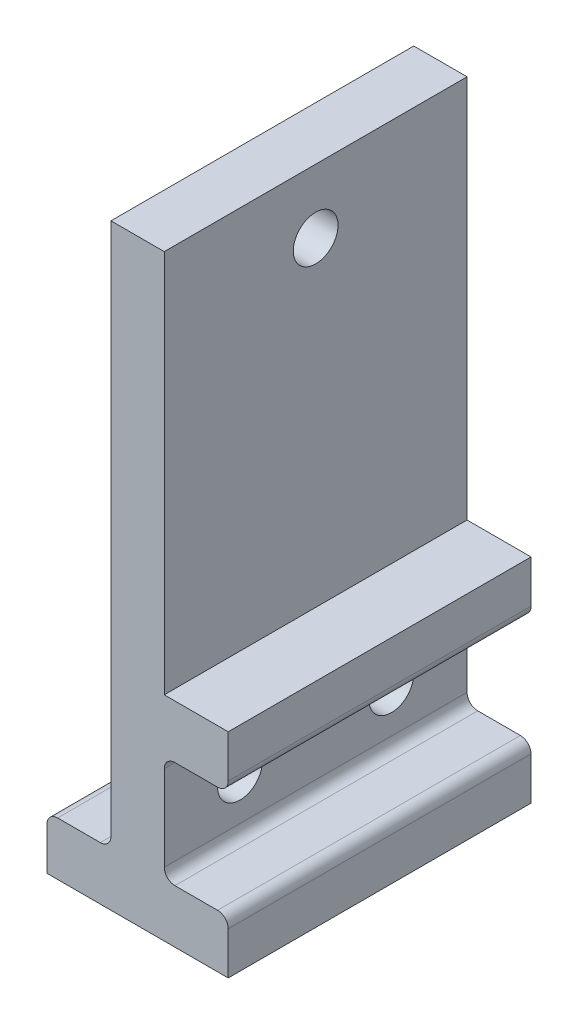
ISO-10303-21;
HEADER;
FILE_DESCRIPTION(('STEP AP214'),'2;1');
FILE_NAME('part.step','',(''),(''),'','','');
FILE_SCHEMA(('AUTOMOTIVE_DESIGN { 1 0 10303 214 1 1 1 1 }'));
ENDSEC;
DATA;
#1=APPLICATION_CONTEXT('core data for automotive mechanical design processes');
#2=APPLICATION_PROTOCOL_DEFINITION('international standard','automotive_design',2000,#1);
#3=PRODUCT_CONTEXT('',#1,'mechanical');
#4=PRODUCT('Part','Part','',(#3));
#5=PRODUCT_RELATED_PRODUCT_CATEGORY('part','',(#4));
#6=PRODUCT_DEFINITION_FORMATION('','',#4);
#7=PRODUCT_DEFINITION_CONTEXT('part definition',#1,'design');
#8=PRODUCT_DEFINITION('design','',#6,#7);
#9=PRODUCT_DEFINITION_SHAPE('','',#8);
#10=(LENGTH_UNIT() NAMED_UNIT(*) SI_UNIT(.MILLI.,.METRE.));
#11=(NAMED_UNIT(*) PLANE_ANGLE_UNIT() SI_UNIT($,.RADIAN.));
#12=(NAMED_UNIT(*) SI_UNIT($,.STERADIAN.) SOLID_ANGLE_UNIT());
#13=UNCERTAINTY_MEASURE_WITH_UNIT(LENGTH_MEASURE(1.E-05),#10,'distance_accuracy_value','');
#14=(GEOMETRIC_REPRESENTATION_CONTEXT(3) GLOBAL_UNCERTAINTY_ASSIGNED_CONTEXT((#13)) GLOBAL_UNIT_ASSIGNED_CONTEXT((#10,
#11,#12)) REPRESENTATION_CONTEXT('',''));
#15=CARTESIAN_POINT('',(0.,0.,0.));
#16=DIRECTION('',(0.,0.,1.));
#17=DIRECTION('',(1.,0.,0.));
#18=AXIS2_PLACEMENT_3D('',#15,#16,#17);
#19=CARTESIAN_POINT('',(0.,0.,56.8));
#20=DIRECTION('',(0.,1.,0.));
#21=DIRECTION('',(0.,0.,1.));
#22=AXIS2_PLACEMENT_3D('',#19,#20,#21);
#23=PLANE('',#22);
#24=DIRECTION('',(1.,0.,0.));
#25=VECTOR('',#24,1.);
#26=CARTESIAN_POINT('',(0.,0.,0.));
#27=LINE('',#26,#25);
#28=CARTESIAN_POINT('',(0.,0.,0.));
#29=VERTEX_POINT('',#28);
#30=CARTESIAN_POINT('',(34.,0.,0.));
#31=VERTEX_POINT('',#30);
#32=EDGE_CURVE('E185',#29,#31,#27,.T.);
#33=ORIENTED_EDGE('',*,*,#32,.T.);
#34=DIRECTION('',(0.,0.,-1.));
#35=VECTOR('',#34,1.);
#36=CARTESIAN_POINT('',(34.,0.,56.8));
#37=LINE('',#36,#35);
#38=CARTESIAN_POINT('',(34.,0.,56.8));
#39=VERTEX_POINT('',#38);
#40=EDGE_CURVE('E166',#39,#31,#37,.T.);
#41=ORIENTED_EDGE('',*,*,#40,.F.);
#42=DIRECTION('',(1.,0.,0.));
#43=VECTOR('',#42,1.);
#44=CARTESIAN_POINT('',(0.,0.,56.8));
#45=LINE('',#44,#43);
#46=CARTESIAN_POINT('',(0.,0.,56.8));
#47=VERTEX_POINT('',#46);
#48=EDGE_CURVE('E172',#47,#39,#45,.T.);
#49=ORIENTED_EDGE('',*,*,#48,.F.);
#50=DIRECTION('',(0.,0.,-1.));
#51=VECTOR('',#50,1.);
#52=CARTESIAN_POINT('',(0.,0.,56.8));
#53=LINE('',#52,#51);
#54=EDGE_CURVE('E280',#47,#29,#53,.T.);
#55=ORIENTED_EDGE('',*,*,#54,.T.);
#56=EDGE_LOOP('',(#33,#41,#49,#55));
#57=FACE_BOUND('',#56,.T.);
#58=ADVANCED_FACE('F35',(#57),#23,.F.);
#59=CARTESIAN_POINT('',(34.,10.,56.8));
#60=DIRECTION('',(-1.,0.,0.));
#61=DIRECTION('',(0.,0.,1.));
#62=AXIS2_PLACEMENT_3D('',#59,#60,#61);
#63=PLANE('',#62);
#64=DIRECTION('',(0.,1.,0.));
#65=VECTOR('',#64,1.);
#66=CARTESIAN_POINT('',(34.,10.,0.));
#67=LINE('',#66,#65);
#68=CARTESIAN_POINT('',(34.,8.,0.));
#69=VERTEX_POINT('',#68);
#70=EDGE_CURVE('E282',#31,#69,#67,.T.);
#71=ORIENTED_EDGE('',*,*,#70,.T.);
#72=DIRECTION('',(0.,0.,-1.));
#73=VECTOR('',#72,1.);
#74=CARTESIAN_POINT('',(34.,8.,56.8));
#75=LINE('',#74,#73);
#76=CARTESIAN_POINT('',(34.,8.,56.8));
#77=VERTEX_POINT('',#76);
#78=EDGE_CURVE('E169',#69,#77,#75,.F.);
#79=ORIENTED_EDGE('',*,*,#78,.T.);
#80=DIRECTION('',(0.,1.,0.));
#81=VECTOR('',#80,1.);
#82=CARTESIAN_POINT('',(34.,10.,56.8));
#83=LINE('',#82,#81);
#84=EDGE_CURVE('E161',#39,#77,#83,.T.);
#85=ORIENTED_EDGE('',*,*,#84,.F.);
#86=ORIENTED_EDGE('',*,*,#40,.T.);
#87=EDGE_LOOP('',(#71,#79,#85,#86));
#88=FACE_BOUND('',#87,.T.);
#89=ADVANCED_FACE('F164',(#88),#63,.F.);
#90=CARTESIAN_POINT('',(22.,10.,56.8));
#91=DIRECTION('',(0.,-1.,0.));
#92=DIRECTION('',(1.,0.,0.));
#93=AXIS2_PLACEMENT_3D('',#90,#91,#92);
#94=PLANE('',#93);
#95=DIRECTION('',(-1.,0.,0.));
#96=VECTOR('',#95,1.);
#97=CARTESIAN_POINT('',(22.,10.,56.8));
#98=LINE('',#97,#96);
#99=CARTESIAN_POINT('',(32.,10.,56.8));
#100=VERTEX_POINT('',#99);
#101=CARTESIAN_POINT('',(24.,10.,56.8));
#102=VERTEX_POINT('',#101);
#103=EDGE_CURVE('E171',#100,#102,#98,.T.);
#104=ORIENTED_EDGE('',*,*,#103,.F.);
#105=DIRECTION('',(0.,0.,-1.));
#106=VECTOR('',#105,1.);
#107=CARTESIAN_POINT('',(32.,10.,56.8));
#108=LINE('',#107,#106);
#109=CARTESIAN_POINT('',(32.,10.,0.));
#110=VERTEX_POINT('',#109);
#111=EDGE_CURVE('E216',#100,#110,#108,.T.);
#112=ORIENTED_EDGE('',*,*,#111,.T.);
#113=DIRECTION('',(-1.,0.,0.));
#114=VECTOR('',#113,1.);
#115=CARTESIAN_POINT('',(22.,10.,0.));
#116=LINE('',#115,#114);
#117=CARTESIAN_POINT('',(24.,10.,0.));
#118=VERTEX_POINT('',#117);
#119=EDGE_CURVE('E255',#110,#118,#116,.T.);
#120=ORIENTED_EDGE('',*,*,#119,.T.);
#121=DIRECTION('',(0.,0.,-1.));
#122=VECTOR('',#121,1.);
#123=CARTESIAN_POINT('',(24.,10.,56.8));
#124=LINE('',#123,#122);
#125=EDGE_CURVE('E214',#118,#102,#124,.F.);
#126=ORIENTED_EDGE('',*,*,#125,.T.);
#127=EDGE_LOOP('',(#104,#112,#120,#126));
#128=FACE_BOUND('',#127,.T.);
#129=ADVANCED_FACE('F353',(#128),#94,.F.);
#130=CARTESIAN_POINT('',(22.,30.,56.8));
#131=DIRECTION('',(-1.,0.,0.));
#132=DIRECTION('',(0.,-1.,0.));
#133=AXIS2_PLACEMENT_3D('',#130,#131,#132);
#134=PLANE('',#133);
#135=CARTESIAN_POINT('',(22.,20.,14.2));
#136=DIRECTION('',(-1.,0.,0.));
#137=DIRECTION('',(0.,-1.,0.));
#138=AXIS2_PLACEMENT_3D('',#135,#136,#137);
#139=CIRCLE('',#138,4.2);
#140=CARTESIAN_POINT('',(22.,15.8,14.2));
#141=VERTEX_POINT('',#140);
#142=EDGE_CURVE('E283',#141,#141,#139,.F.);
#143=ORIENTED_EDGE('',*,*,#142,.F.);
#144=EDGE_LOOP('',(#143));
#145=FACE_BOUND('',#144,.T.);
#146=CARTESIAN_POINT('',(22.,20.,42.6));
#147=DIRECTION('',(-1.,0.,0.));
#148=DIRECTION('',(0.,-1.,0.));
#149=AXIS2_PLACEMENT_3D('',#146,#147,#148);
#150=CIRCLE('',#149,4.2);
#151=CARTESIAN_POINT('',(22.,15.8,42.6));
#152=VERTEX_POINT('',#151);
#153=EDGE_CURVE('E356',#152,#152,#150,.F.);
#154=ORIENTED_EDGE('',*,*,#153,.F.);
#155=EDGE_LOOP('',(#154));
#156=FACE_BOUND('',#155,.T.);
#157=DIRECTION('',(0.,1.,0.));
#158=VECTOR('',#157,1.);
#159=CARTESIAN_POINT('',(22.,30.,56.8));
#160=LINE('',#159,#158);
#161=CARTESIAN_POINT('',(22.,12.,56.8));
#162=VERTEX_POINT('',#161);
#163=CARTESIAN_POINT('',(22.,28.,56.8));
#164=VERTEX_POINT('',#163);
#165=EDGE_CURVE('E260',#162,#164,#160,.T.);
#166=ORIENTED_EDGE('',*,*,#165,.F.);
#167=DIRECTION('',(0.,0.,-1.));
#168=VECTOR('',#167,1.);
#169=CARTESIAN_POINT('',(22.,12.,0.));
#170=LINE('',#169,#168);
#171=CARTESIAN_POINT('',(22.,12.,0.));
#172=VERTEX_POINT('',#171);
#173=EDGE_CURVE('E222',#162,#172,#170,.T.);
#174=ORIENTED_EDGE('',*,*,#173,.T.);
#175=DIRECTION('',(0.,1.,0.));
#176=VECTOR('',#175,1.);
#177=CARTESIAN_POINT('',(22.,30.,0.));
#178=LINE('',#177,#176);
#179=CARTESIAN_POINT('',(22.,28.,0.));
#180=VERTEX_POINT('',#179);
#181=EDGE_CURVE('E245',#172,#180,#178,.T.);
#182=ORIENTED_EDGE('',*,*,#181,.T.);
#183=DIRECTION('',(0.,0.,-1.));
#184=VECTOR('',#183,1.);
#185=CARTESIAN_POINT('',(22.,28.,56.8));
#186=LINE('',#185,#184);
#187=EDGE_CURVE('E220',#180,#164,#186,.F.);
#188=ORIENTED_EDGE('',*,*,#187,.T.);
#189=EDGE_LOOP('',(#166,#174,#182,#188));
#190=FACE_BOUND('',#189,.T.);
#191=ADVANCED_FACE('F252',(#145,#156,#190),#134,.F.);
#192=CARTESIAN_POINT('',(34.,30.,56.8));
#193=DIRECTION('',(0.,1.,0.));
#194=DIRECTION('',(-1.,0.,0.));
#195=AXIS2_PLACEMENT_3D('',#192,#193,#194);
#196=PLANE('',#195);
#197=DIRECTION('',(1.,0.,0.));
#198=VECTOR('',#197,1.);
#199=CARTESIAN_POINT('',(34.,30.,56.8));
#200=LINE('',#199,#198);
#201=CARTESIAN_POINT('',(24.,30.,56.8));
#202=VERTEX_POINT('',#201);
#203=CARTESIAN_POINT('',(32.,30.,56.8));
#204=VERTEX_POINT('',#203);
#205=EDGE_CURVE('E259',#202,#204,#200,.T.);
#206=ORIENTED_EDGE('',*,*,#205,.F.);
#207=DIRECTION('',(0.,0.,-1.));
#208=VECTOR('',#207,1.);
#209=CARTESIAN_POINT('',(24.,30.,0.));
#210=LINE('',#209,#208);
#211=CARTESIAN_POINT('',(24.,30.,0.));
#212=VERTEX_POINT('',#211);
#213=EDGE_CURVE('E226',#202,#212,#210,.T.);
#214=ORIENTED_EDGE('',*,*,#213,.T.);
#215=DIRECTION('',(1.,0.,0.));
#216=VECTOR('',#215,1.);
#217=CARTESIAN_POINT('',(34.,30.,0.));
#218=LINE('',#217,#216);
#219=CARTESIAN_POINT('',(32.,30.,0.));
#220=VERTEX_POINT('',#219);
#221=EDGE_CURVE('E246',#212,#220,#218,.T.);
#222=ORIENTED_EDGE('',*,*,#221,.T.);
#223=DIRECTION('',(0.,0.,-1.));
#224=VECTOR('',#223,1.);
#225=CARTESIAN_POINT('',(32.,30.,56.8));
#226=LINE('',#225,#224);
#227=EDGE_CURVE('E58',#220,#204,#226,.F.);
#228=ORIENTED_EDGE('',*,*,#227,.T.);
#229=EDGE_LOOP('',(#206,#214,#222,#228));
#230=FACE_BOUND('',#229,.T.);
#231=ADVANCED_FACE('F261',(#230),#196,.F.);
#232=CARTESIAN_POINT('',(34.,40.,56.8));
#233=DIRECTION('',(-1.,0.,0.));
#234=DIRECTION('',(0.,0.,1.));
#235=AXIS2_PLACEMENT_3D('',#232,#233,#234);
#236=PLANE('',#235);
#237=DIRECTION('',(0.,1.,0.));
#238=VECTOR('',#237,1.);
#239=CARTESIAN_POINT('',(34.,40.,56.8));
#240=LINE('',#239,#238);
#241=CARTESIAN_POINT('',(34.,32.,56.8));
#242=VERTEX_POINT('',#241);
#243=CARTESIAN_POINT('',(34.,40.,56.8));
#244=VERTEX_POINT('',#243);
#245=EDGE_CURVE('E262',#242,#244,#240,.T.);
#246=ORIENTED_EDGE('',*,*,#245,.F.);
#247=DIRECTION('',(0.,0.,-1.));
#248=VECTOR('',#247,1.);
#249=CARTESIAN_POINT('',(34.,32.,56.8));
#250=LINE('',#249,#248);
#251=CARTESIAN_POINT('',(34.,32.,0.));
#252=VERTEX_POINT('',#251);
#253=EDGE_CURVE('E229',#242,#252,#250,.T.);
#254=ORIENTED_EDGE('',*,*,#253,.T.);
#255=DIRECTION('',(0.,1.,0.));
#256=VECTOR('',#255,1.);
#257=CARTESIAN_POINT('',(34.,40.,0.));
#258=LINE('',#257,#256);
#259=CARTESIAN_POINT('',(34.,40.,0.));
#260=VERTEX_POINT('',#259);
#261=EDGE_CURVE('E288',#252,#260,#258,.T.);
#262=ORIENTED_EDGE('',*,*,#261,.T.);
#263=DIRECTION('',(0.,0.,-1.));
#264=VECTOR('',#263,1.);
#265=CARTESIAN_POINT('',(34.,40.,56.8));
#266=LINE('',#265,#264);
#267=EDGE_CURVE('E187',#244,#260,#266,.T.);
#268=ORIENTED_EDGE('',*,*,#267,.F.);
#269=EDGE_LOOP('',(#246,#254,#262,#268));
#270=FACE_BOUND('',#269,.T.);
#271=ADVANCED_FACE('F398',(#270),#236,.F.);
#272=CARTESIAN_POINT('',(22.,40.,56.8));
#273=DIRECTION('',(0.,-1.,0.));
#274=DIRECTION('',(0.,0.,-1.));
#275=AXIS2_PLACEMENT_3D('',#272,#273,#274);
#276=PLANE('',#275);
#277=DIRECTION('',(-1.,0.,0.));
#278=VECTOR('',#277,1.);
#279=CARTESIAN_POINT('',(22.,40.,0.));
#280=LINE('',#279,#278);
#281=CARTESIAN_POINT('',(22.,40.,0.));
#282=VERTEX_POINT('',#281);
#283=EDGE_CURVE('E290',#260,#282,#280,.T.);
#284=ORIENTED_EDGE('',*,*,#283,.T.);
#285=DIRECTION('',(0.,0.,-1.));
#286=VECTOR('',#285,1.);
#287=CARTESIAN_POINT('',(22.,40.,56.8));
#288=LINE('',#287,#286);
#289=CARTESIAN_POINT('',(22.,40.,56.8));
#290=VERTEX_POINT('',#289);
#291=EDGE_CURVE('E192',#290,#282,#288,.T.);
#292=ORIENTED_EDGE('',*,*,#291,.F.);
#293=DIRECTION('',(-1.,0.,0.));
#294=VECTOR('',#293,1.);
#295=CARTESIAN_POINT('',(22.,40.,56.8));
#296=LINE('',#295,#294);
#297=EDGE_CURVE('E264',#244,#290,#296,.T.);
#298=ORIENTED_EDGE('',*,*,#297,.F.);
#299=ORIENTED_EDGE('',*,*,#267,.T.);
#300=EDGE_LOOP('',(#284,#292,#298,#299));
#301=FACE_BOUND('',#300,.T.);
#302=ADVANCED_FACE('F428',(#301),#276,.F.);
#303=CARTESIAN_POINT('',(22.,112.,56.8));
#304=DIRECTION('',(-1.,0.,0.));
#305=DIRECTION('',(0.,-1.,0.));
#306=AXIS2_PLACEMENT_3D('',#303,#304,#305);
#307=PLANE('',#306);
#308=CARTESIAN_POINT('',(22.,100.,28.4));
#309=DIRECTION('',(-1.,0.,0.));
#310=DIRECTION('',(0.,-1.,0.));
#311=AXIS2_PLACEMENT_3D('',#308,#309,#310);
#312=CIRCLE('',#311,4.2);
#313=CARTESIAN_POINT('',(22.,95.8,28.4));
#314=VERTEX_POINT('',#313);
#315=EDGE_CURVE('E363',#314,#314,#312,.F.);
#316=ORIENTED_EDGE('',*,*,#315,.F.);
#317=EDGE_LOOP('',(#316));
#318=FACE_BOUND('',#317,.T.);
#319=DIRECTION('',(0.,1.,0.));
#320=VECTOR('',#319,1.);
#321=CARTESIAN_POINT('',(22.,112.,0.));
#322=LINE('',#321,#320);
#323=CARTESIAN_POINT('',(22.,112.,0.));
#324=VERTEX_POINT('',#323);
#325=EDGE_CURVE('E292',#282,#324,#322,.T.);
#326=ORIENTED_EDGE('',*,*,#325,.T.);
#327=DIRECTION('',(0.,0.,-1.));
#328=VECTOR('',#327,1.);
#329=CARTESIAN_POINT('',(22.,112.,56.8));
#330=LINE('',#329,#328);
#331=CARTESIAN_POINT('',(22.,112.,56.8));
#332=VERTEX_POINT('',#331);
#333=EDGE_CURVE('E307',#332,#324,#330,.T.);
#334=ORIENTED_EDGE('',*,*,#333,.F.);
#335=DIRECTION('',(0.,1.,0.));
#336=VECTOR('',#335,1.);
#337=CARTESIAN_POINT('',(22.,112.,56.8));
#338=LINE('',#337,#336);
#339=EDGE_CURVE('E270',#290,#332,#338,.T.);
#340=ORIENTED_EDGE('',*,*,#339,.F.);
#341=ORIENTED_EDGE('',*,*,#291,.T.);
#342=EDGE_LOOP('',(#326,#334,#340,#341));
#343=FACE_BOUND('',#342,.T.);
#344=ADVANCED_FACE('F314',(#318,#343),#307,.F.);
#345=CARTESIAN_POINT('',(12.,112.,56.8));
#346=DIRECTION('',(0.,-1.,0.));
#347=DIRECTION('',(0.,0.,-1.));
#348=AXIS2_PLACEMENT_3D('',#345,#346,#347);
#349=PLANE('',#348);
#350=DIRECTION('',(-1.,0.,0.));
#351=VECTOR('',#350,1.);
#352=CARTESIAN_POINT('',(12.,112.,0.));
#353=LINE('',#352,#351);
#354=CARTESIAN_POINT('',(12.,112.,0.));
#355=VERTEX_POINT('',#354);
#356=EDGE_CURVE('E294',#324,#355,#353,.T.);
#357=ORIENTED_EDGE('',*,*,#356,.T.);
#358=DIRECTION('',(0.,0.,-1.));
#359=VECTOR('',#358,1.);
#360=CARTESIAN_POINT('',(12.,112.,56.8));
#361=LINE('',#360,#359);
#362=CARTESIAN_POINT('',(12.,112.,56.8));
#363=VERTEX_POINT('',#362);
#364=EDGE_CURVE('E304',#363,#355,#361,.T.);
#365=ORIENTED_EDGE('',*,*,#364,.F.);
#366=DIRECTION('',(-1.,0.,0.));
#367=VECTOR('',#366,1.);
#368=CARTESIAN_POINT('',(12.,112.,56.8));
#369=LINE('',#368,#367);
#370=EDGE_CURVE('E272',#332,#363,#369,.T.);
#371=ORIENTED_EDGE('',*,*,#370,.F.);
#372=ORIENTED_EDGE('',*,*,#333,.T.);
#373=EDGE_LOOP('',(#357,#365,#371,#372));
#374=FACE_BOUND('',#373,.T.);
#375=ADVANCED_FACE('F324',(#374),#349,.F.);
#376=CARTESIAN_POINT('',(12.,10.,56.8));
#377=DIRECTION('',(1.,0.,0.));
#378=DIRECTION('',(0.,0.,-1.));
#379=AXIS2_PLACEMENT_3D('',#376,#377,#378);
#380=PLANE('',#379);
#381=CARTESIAN_POINT('',(12.,100.,28.4));
#382=DIRECTION('',(-1.,0.,0.));
#383=DIRECTION('',(0.,-1.,0.));
#384=AXIS2_PLACEMENT_3D('',#381,#382,#383);
#385=CIRCLE('',#384,4.2);
#386=CARTESIAN_POINT('',(12.,95.8,28.4));
#387=VERTEX_POINT('',#386);
#388=EDGE_CURVE('E370',#387,#387,#385,.T.);
#389=ORIENTED_EDGE('',*,*,#388,.F.);
#390=EDGE_LOOP('',(#389));
#391=FACE_BOUND('',#390,.T.);
#392=CARTESIAN_POINT('',(12.,20.,14.2));
#393=DIRECTION('',(-1.,0.,0.));
#394=DIRECTION('',(0.,-1.,0.));
#395=AXIS2_PLACEMENT_3D('',#392,#393,#394);
#396=CIRCLE('',#395,4.2);
#397=CARTESIAN_POINT('',(12.,15.8,14.2));
#398=VERTEX_POINT('',#397);
#399=EDGE_CURVE('E359',#398,#398,#396,.T.);
#400=ORIENTED_EDGE('',*,*,#399,.F.);
#401=EDGE_LOOP('',(#400));
#402=FACE_BOUND('',#401,.T.);
#403=CARTESIAN_POINT('',(12.,20.,42.6));
#404=DIRECTION('',(-1.,0.,0.));
#405=DIRECTION('',(0.,1.,0.));
#406=AXIS2_PLACEMENT_3D('',#403,#404,#405);
#407=CIRCLE('',#406,4.2);
#408=CARTESIAN_POINT('',(12.,24.2,42.6));
#409=VERTEX_POINT('',#408);
#410=EDGE_CURVE('E360',#409,#409,#407,.T.);
#411=ORIENTED_EDGE('',*,*,#410,.F.);
#412=EDGE_LOOP('',(#411));
#413=FACE_BOUND('',#412,.T.);
#414=DIRECTION('',(0.,-1.,0.));
#415=VECTOR('',#414,1.);
#416=CARTESIAN_POINT('',(12.,10.,0.));
#417=LINE('',#416,#415);
#418=CARTESIAN_POINT('',(12.,12.,0.));
#419=VERTEX_POINT('',#418);
#420=EDGE_CURVE('E296',#355,#419,#417,.T.);
#421=ORIENTED_EDGE('',*,*,#420,.T.);
#422=DIRECTION('',(0.,0.,-1.));
#423=VECTOR('',#422,1.);
#424=CARTESIAN_POINT('',(12.,12.,56.8));
#425=LINE('',#424,#423);
#426=CARTESIAN_POINT('',(12.,12.,56.8));
#427=VERTEX_POINT('',#426);
#428=EDGE_CURVE('E198',#419,#427,#425,.F.);
#429=ORIENTED_EDGE('',*,*,#428,.T.);
#430=DIRECTION('',(0.,-1.,0.));
#431=VECTOR('',#430,1.);
#432=CARTESIAN_POINT('',(12.,10.,56.8));
#433=LINE('',#432,#431);
#434=EDGE_CURVE('E274',#363,#427,#433,.T.);
#435=ORIENTED_EDGE('',*,*,#434,.F.);
#436=ORIENTED_EDGE('',*,*,#364,.T.);
#437=EDGE_LOOP('',(#421,#429,#435,#436));
#438=FACE_BOUND('',#437,.T.);
#439=ADVANCED_FACE('F328',(#391,#402,#413,#438),#380,.F.);
#440=CARTESIAN_POINT('',(0.,10.,56.8));
#441=DIRECTION('',(0.,-1.,0.));
#442=DIRECTION('',(0.,0.,-1.));
#443=AXIS2_PLACEMENT_3D('',#440,#441,#442);
#444=PLANE('',#443);
#445=DIRECTION('',(-1.,0.,0.));
#446=VECTOR('',#445,1.);
#447=CARTESIAN_POINT('',(0.,10.,56.8));
#448=LINE('',#447,#446);
#449=CARTESIAN_POINT('',(10.,10.,56.8));
#450=VERTEX_POINT('',#449);
#451=CARTESIAN_POINT('',(2.,10.,56.8));
#452=VERTEX_POINT('',#451);
#453=EDGE_CURVE('E277',#450,#452,#448,.T.);
#454=ORIENTED_EDGE('',*,*,#453,.F.);
#455=DIRECTION('',(0.,0.,-1.));
#456=VECTOR('',#455,1.);
#457=CARTESIAN_POINT('',(10.,10.,0.));
#458=LINE('',#457,#456);
#459=CARTESIAN_POINT('',(10.,10.,0.));
#460=VERTEX_POINT('',#459);
#461=EDGE_CURVE('E189',#450,#460,#458,.T.);
#462=ORIENTED_EDGE('',*,*,#461,.T.);
#463=DIRECTION('',(-1.,0.,0.));
#464=VECTOR('',#463,1.);
#465=CARTESIAN_POINT('',(0.,10.,0.));
#466=LINE('',#465,#464);
#467=CARTESIAN_POINT('',(2.,10.,0.));
#468=VERTEX_POINT('',#467);
#469=EDGE_CURVE('E299',#460,#468,#466,.T.);
#470=ORIENTED_EDGE('',*,*,#469,.T.);
#471=DIRECTION('',(0.,0.,-1.));
#472=VECTOR('',#471,1.);
#473=CARTESIAN_POINT('',(2.,10.,56.8));
#474=LINE('',#473,#472);
#475=EDGE_CURVE('E186',#468,#452,#474,.F.);
#476=ORIENTED_EDGE('',*,*,#475,.T.);
#477=EDGE_LOOP('',(#454,#462,#470,#476));
#478=FACE_BOUND('',#477,.T.);
#479=ADVANCED_FACE('F337',(#478),#444,.F.);
#480=CARTESIAN_POINT('',(0.,0.,56.8));
#481=DIRECTION('',(1.,0.,0.));
#482=DIRECTION('',(0.,0.,-1.));
#483=AXIS2_PLACEMENT_3D('',#480,#481,#482);
#484=PLANE('',#483);
#485=DIRECTION('',(0.,-1.,0.));
#486=VECTOR('',#485,1.);
#487=CARTESIAN_POINT('',(0.,0.,56.8));
#488=LINE('',#487,#486);
#489=CARTESIAN_POINT('',(0.,8.,56.8));
#490=VERTEX_POINT('',#489);
#491=EDGE_CURVE('E178',#490,#47,#488,.T.);
#492=ORIENTED_EDGE('',*,*,#491,.F.);
#493=DIRECTION('',(0.,0.,-1.));
#494=VECTOR('',#493,1.);
#495=CARTESIAN_POINT('',(0.,8.,56.8));
#496=LINE('',#495,#494);
#497=CARTESIAN_POINT('',(0.,8.,0.));
#498=VERTEX_POINT('',#497);
#499=EDGE_CURVE('E200',#490,#498,#496,.T.);
#500=ORIENTED_EDGE('',*,*,#499,.T.);
#501=DIRECTION('',(0.,-1.,0.));
#502=VECTOR('',#501,1.);
#503=CARTESIAN_POINT('',(0.,0.,0.));
#504=LINE('',#503,#502);
#505=EDGE_CURVE('E182',#498,#29,#504,.T.);
#506=ORIENTED_EDGE('',*,*,#505,.T.);
#507=ORIENTED_EDGE('',*,*,#54,.F.);
#508=EDGE_LOOP('',(#492,#500,#506,#507));
#509=FACE_BOUND('',#508,.T.);
#510=ADVANCED_FACE('F344',(#509),#484,.F.);
#511=CARTESIAN_POINT('',(0.,0.,56.8));
#512=DIRECTION('',(0.,0.,-1.));
#513=DIRECTION('',(-1.,0.,0.));
#514=AXIS2_PLACEMENT_3D('',#511,#512,#513);
#515=PLANE('',#514);
#516=ORIENTED_EDGE('',*,*,#453,.T.);
#517=CARTESIAN_POINT('',(2.,8.,56.8));
#518=DIRECTION('',(0.,0.,-1.));
#519=DIRECTION('',(-1.,0.,0.));
#520=AXIS2_PLACEMENT_3D('',#517,#518,#519);
#521=CIRCLE('',#520,2.);
#522=EDGE_CURVE('E212',#452,#490,#521,.F.);
#523=ORIENTED_EDGE('',*,*,#522,.T.);
#524=ORIENTED_EDGE('',*,*,#491,.T.);
#525=ORIENTED_EDGE('',*,*,#48,.T.);
#526=ORIENTED_EDGE('',*,*,#84,.T.);
#527=CARTESIAN_POINT('',(32.,8.,56.8));
#528=DIRECTION('',(0.,0.,-1.));
#529=DIRECTION('',(-1.,0.,0.));
#530=AXIS2_PLACEMENT_3D('',#527,#528,#529);
#531=CIRCLE('',#530,2.);
#532=EDGE_CURVE('E210',#77,#100,#531,.F.);
#533=ORIENTED_EDGE('',*,*,#532,.T.);
#534=ORIENTED_EDGE('',*,*,#103,.T.);
#535=CARTESIAN_POINT('',(24.,12.,56.8));
#536=DIRECTION('',(0.,0.,-1.));
#537=DIRECTION('',(-1.,0.,0.));
#538=AXIS2_PLACEMENT_3D('',#535,#536,#537);
#539=CIRCLE('',#538,2.);
#540=EDGE_CURVE('E238',#102,#162,#539,.T.);
#541=ORIENTED_EDGE('',*,*,#540,.T.);
#542=ORIENTED_EDGE('',*,*,#165,.T.);
#543=CARTESIAN_POINT('',(24.,28.,56.8));
#544=DIRECTION('',(0.,0.,-1.));
#545=DIRECTION('',(-1.,0.,0.));
#546=AXIS2_PLACEMENT_3D('',#543,#544,#545);
#547=CIRCLE('',#546,2.);
#548=EDGE_CURVE('E11',#164,#202,#547,.T.);
#549=ORIENTED_EDGE('',*,*,#548,.T.);
#550=ORIENTED_EDGE('',*,*,#205,.T.);
#551=CARTESIAN_POINT('',(32.,32.,56.8));
#552=DIRECTION('',(0.,0.,-1.));
#553=DIRECTION('',(-1.,0.,0.));
#554=AXIS2_PLACEMENT_3D('',#551,#552,#553);
#555=CIRCLE('',#554,2.);
#556=EDGE_CURVE('E50',#204,#242,#555,.F.);
#557=ORIENTED_EDGE('',*,*,#556,.T.);
#558=ORIENTED_EDGE('',*,*,#245,.T.);
#559=ORIENTED_EDGE('',*,*,#297,.T.);
#560=ORIENTED_EDGE('',*,*,#339,.T.);
#561=ORIENTED_EDGE('',*,*,#370,.T.);
#562=ORIENTED_EDGE('',*,*,#434,.T.);
#563=CARTESIAN_POINT('',(10.,12.,56.8));
#564=DIRECTION('',(0.,0.,-1.));
#565=DIRECTION('',(-1.,0.,0.));
#566=AXIS2_PLACEMENT_3D('',#563,#564,#565);
#567=CIRCLE('',#566,2.);
#568=EDGE_CURVE('E234',#427,#450,#567,.T.);
#569=ORIENTED_EDGE('',*,*,#568,.T.);
#570=EDGE_LOOP('',(#516,#523,#524,#525,#526,#533,#534,#541,#542,#549,#550,#557,#558,#559,#560,
#561,#562,#569));
#571=FACE_BOUND('',#570,.T.);
#572=ADVANCED_FACE('F176',(#571),#515,.F.);
#573=CARTESIAN_POINT('',(0.,0.,0.));
#574=DIRECTION('',(0.,0.,-1.));
#575=DIRECTION('',(-1.,0.,0.));
#576=AXIS2_PLACEMENT_3D('',#573,#574,#575);
#577=PLANE('',#576);
#578=ORIENTED_EDGE('',*,*,#505,.F.);
#579=CARTESIAN_POINT('',(2.,8.,0.));
#580=DIRECTION('',(0.,0.,-1.));
#581=DIRECTION('',(-1.,0.,0.));
#582=AXIS2_PLACEMENT_3D('',#579,#580,#581);
#583=CIRCLE('',#582,2.);
#584=EDGE_CURVE('E207',#498,#468,#583,.T.);
#585=ORIENTED_EDGE('',*,*,#584,.T.);
#586=ORIENTED_EDGE('',*,*,#469,.F.);
#587=CARTESIAN_POINT('',(10.,12.,0.));
#588=DIRECTION('',(0.,0.,-1.));
#589=DIRECTION('',(-1.,0.,0.));
#590=AXIS2_PLACEMENT_3D('',#587,#588,#589);
#591=CIRCLE('',#590,2.);
#592=EDGE_CURVE('E232',#460,#419,#591,.F.);
#593=ORIENTED_EDGE('',*,*,#592,.T.);
#594=ORIENTED_EDGE('',*,*,#420,.F.);
#595=ORIENTED_EDGE('',*,*,#356,.F.);
#596=ORIENTED_EDGE('',*,*,#325,.F.);
#597=ORIENTED_EDGE('',*,*,#283,.F.);
#598=ORIENTED_EDGE('',*,*,#261,.F.);
#599=CARTESIAN_POINT('',(32.,32.,0.));
#600=DIRECTION('',(0.,0.,-1.));
#601=DIRECTION('',(-1.,0.,0.));
#602=AXIS2_PLACEMENT_3D('',#599,#600,#601);
#603=CIRCLE('',#602,2.);
#604=EDGE_CURVE('E203',#252,#220,#603,.T.);
#605=ORIENTED_EDGE('',*,*,#604,.T.);
#606=ORIENTED_EDGE('',*,*,#221,.F.);
#607=CARTESIAN_POINT('',(24.,28.,0.));
#608=DIRECTION('',(0.,0.,-1.));
#609=DIRECTION('',(-1.,0.,0.));
#610=AXIS2_PLACEMENT_3D('',#607,#608,#609);
#611=CIRCLE('',#610,2.);
#612=EDGE_CURVE('E43',#212,#180,#611,.F.);
#613=ORIENTED_EDGE('',*,*,#612,.T.);
#614=ORIENTED_EDGE('',*,*,#181,.F.);
#615=CARTESIAN_POINT('',(24.,12.,0.));
#616=DIRECTION('',(0.,0.,-1.));
#617=DIRECTION('',(-1.,0.,0.));
#618=AXIS2_PLACEMENT_3D('',#615,#616,#617);
#619=CIRCLE('',#618,2.);
#620=EDGE_CURVE('E236',#172,#118,#619,.F.);
#621=ORIENTED_EDGE('',*,*,#620,.T.);
#622=ORIENTED_EDGE('',*,*,#119,.F.);
#623=CARTESIAN_POINT('',(32.,8.,0.));
#624=DIRECTION('',(0.,0.,-1.));
#625=DIRECTION('',(-1.,0.,0.));
#626=AXIS2_PLACEMENT_3D('',#623,#624,#625);
#627=CIRCLE('',#626,2.);
#628=EDGE_CURVE('E205',#110,#69,#627,.T.);
#629=ORIENTED_EDGE('',*,*,#628,.T.);
#630=ORIENTED_EDGE('',*,*,#70,.F.);
#631=ORIENTED_EDGE('',*,*,#32,.F.);
#632=EDGE_LOOP('',(#578,#585,#586,#593,#594,#595,#596,#597,#598,#605,#606,#613,#614,#621,#622,
#629,#630,#631));
#633=FACE_BOUND('',#632,.T.);
#634=ADVANCED_FACE('F244',(#633),#577,.T.);
#635=CARTESIAN_POINT('',(34.001,20.,42.6));
#636=DIRECTION('',(-1.,0.,0.));
#637=DIRECTION('',(0.,-1.,0.));
#638=AXIS2_PLACEMENT_3D('',#635,#636,#637);
#639=CYLINDRICAL_SURFACE('',#638,4.2);
#640=ORIENTED_EDGE('',*,*,#410,.T.);
#641=EDGE_LOOP('',(#640));
#642=FACE_BOUND('',#641,.T.);
#643=ORIENTED_EDGE('',*,*,#153,.T.);
#644=EDGE_LOOP('',(#643));
#645=FACE_BOUND('',#644,.T.);
#646=ADVANCED_FACE('F384',(#642,#645),#639,.F.);
#647=CARTESIAN_POINT('',(34.001,20.,14.2));
#648=DIRECTION('',(-1.,0.,0.));
#649=DIRECTION('',(0.,-1.,0.));
#650=AXIS2_PLACEMENT_3D('',#647,#648,#649);
#651=CYLINDRICAL_SURFACE('',#650,4.2);
#652=ORIENTED_EDGE('',*,*,#399,.T.);
#653=EDGE_LOOP('',(#652));
#654=FACE_BOUND('',#653,.T.);
#655=ORIENTED_EDGE('',*,*,#142,.T.);
#656=EDGE_LOOP('',(#655));
#657=FACE_BOUND('',#656,.T.);
#658=ADVANCED_FACE('F387',(#654,#657),#651,.F.);
#659=CARTESIAN_POINT('',(34.001,100.,28.4));
#660=DIRECTION('',(-1.,0.,0.));
#661=DIRECTION('',(0.,-1.,0.));
#662=AXIS2_PLACEMENT_3D('',#659,#660,#661);
#663=CYLINDRICAL_SURFACE('',#662,4.2);
#664=ORIENTED_EDGE('',*,*,#388,.T.);
#665=EDGE_LOOP('',(#664));
#666=FACE_BOUND('',#665,.T.);
#667=ORIENTED_EDGE('',*,*,#315,.T.);
#668=EDGE_LOOP('',(#667));
#669=FACE_BOUND('',#668,.T.);
#670=ADVANCED_FACE('F374',(#666,#669),#663,.F.);
#671=CARTESIAN_POINT('',(10.,12.,56.8));
#672=DIRECTION('',(0.,0.,1.));
#673=DIRECTION('',(1.,0.,0.));
#674=AXIS2_PLACEMENT_3D('',#671,#672,#673);
#675=CYLINDRICAL_SURFACE('',#674,2.);
#676=ORIENTED_EDGE('',*,*,#568,.F.);
#677=ORIENTED_EDGE('',*,*,#428,.F.);
#678=ORIENTED_EDGE('',*,*,#592,.F.);
#679=ORIENTED_EDGE('',*,*,#461,.F.);
#680=EDGE_LOOP('',(#676,#677,#678,#679));
#681=FACE_BOUND('',#680,.T.);
#682=ADVANCED_FACE('F334',(#681),#675,.F.);
#683=CARTESIAN_POINT('',(2.,8.,56.8));
#684=DIRECTION('',(0.,0.,-1.));
#685=DIRECTION('',(-1.,0.,0.));
#686=AXIS2_PLACEMENT_3D('',#683,#684,#685);
#687=CYLINDRICAL_SURFACE('',#686,2.);
#688=ORIENTED_EDGE('',*,*,#522,.F.);
#689=ORIENTED_EDGE('',*,*,#475,.F.);
#690=ORIENTED_EDGE('',*,*,#584,.F.);
#691=ORIENTED_EDGE('',*,*,#499,.F.);
#692=EDGE_LOOP('',(#688,#689,#690,#691));
#693=FACE_BOUND('',#692,.T.);
#694=ADVANCED_FACE('F342',(#693),#687,.T.);
#695=CARTESIAN_POINT('',(32.,8.,56.8));
#696=DIRECTION('',(0.,0.,-1.));
#697=DIRECTION('',(-1.,0.,0.));
#698=AXIS2_PLACEMENT_3D('',#695,#696,#697);
#699=CYLINDRICAL_SURFACE('',#698,2.);
#700=ORIENTED_EDGE('',*,*,#532,.F.);
#701=ORIENTED_EDGE('',*,*,#78,.F.);
#702=ORIENTED_EDGE('',*,*,#628,.F.);
#703=ORIENTED_EDGE('',*,*,#111,.F.);
#704=EDGE_LOOP('',(#700,#701,#702,#703));
#705=FACE_BOUND('',#704,.T.);
#706=ADVANCED_FACE('F347',(#705),#699,.T.);
#707=CARTESIAN_POINT('',(24.,12.,56.8));
#708=DIRECTION('',(0.,0.,1.));
#709=DIRECTION('',(1.,0.,0.));
#710=AXIS2_PLACEMENT_3D('',#707,#708,#709);
#711=CYLINDRICAL_SURFACE('',#710,2.);
#712=ORIENTED_EDGE('',*,*,#540,.F.);
#713=ORIENTED_EDGE('',*,*,#125,.F.);
#714=ORIENTED_EDGE('',*,*,#620,.F.);
#715=ORIENTED_EDGE('',*,*,#173,.F.);
#716=EDGE_LOOP('',(#712,#713,#714,#715));
#717=FACE_BOUND('',#716,.T.);
#718=ADVANCED_FACE('F415',(#717),#711,.F.);
#719=CARTESIAN_POINT('',(24.,28.,56.8));
#720=DIRECTION('',(0.,0.,1.));
#721=DIRECTION('',(1.,0.,0.));
#722=AXIS2_PLACEMENT_3D('',#719,#720,#721);
#723=CYLINDRICAL_SURFACE('',#722,2.);
#724=ORIENTED_EDGE('',*,*,#548,.F.);
#725=ORIENTED_EDGE('',*,*,#187,.F.);
#726=ORIENTED_EDGE('',*,*,#612,.F.);
#727=ORIENTED_EDGE('',*,*,#213,.F.);
#728=EDGE_LOOP('',(#724,#725,#726,#727));
#729=FACE_BOUND('',#728,.T.);
#730=ADVANCED_FACE('F258',(#729),#723,.F.);
#731=CARTESIAN_POINT('',(32.,32.,56.8));
#732=DIRECTION('',(0.,0.,-1.));
#733=DIRECTION('',(-1.,0.,0.));
#734=AXIS2_PLACEMENT_3D('',#731,#732,#733);
#735=CYLINDRICAL_SURFACE('',#734,2.);
#736=ORIENTED_EDGE('',*,*,#556,.F.);
#737=ORIENTED_EDGE('',*,*,#227,.F.);
#738=ORIENTED_EDGE('',*,*,#604,.F.);
#739=ORIENTED_EDGE('',*,*,#253,.F.);
#740=EDGE_LOOP('',(#736,#737,#738,#739));
#741=FACE_BOUND('',#740,.T.);
#742=ADVANCED_FACE('F37',(#741),#735,.T.);
#743=CLOSED_SHELL('',(#58,#89,#129,#191,#231,#271,#302,#344,#375,#439,#479,#510,#572,#634,#646,
#658,#670,#682,#694,#706,#718,#730,#742));
#744=MANIFOLD_SOLID_BREP('B2',#743);
#745=ADVANCED_BREP_SHAPE_REPRESENTATION('',(#18,#744),#14);
#746=SHAPE_DEFINITION_REPRESENTATION(#9,#745);
ENDSEC;
END-ISO-10303-21;
